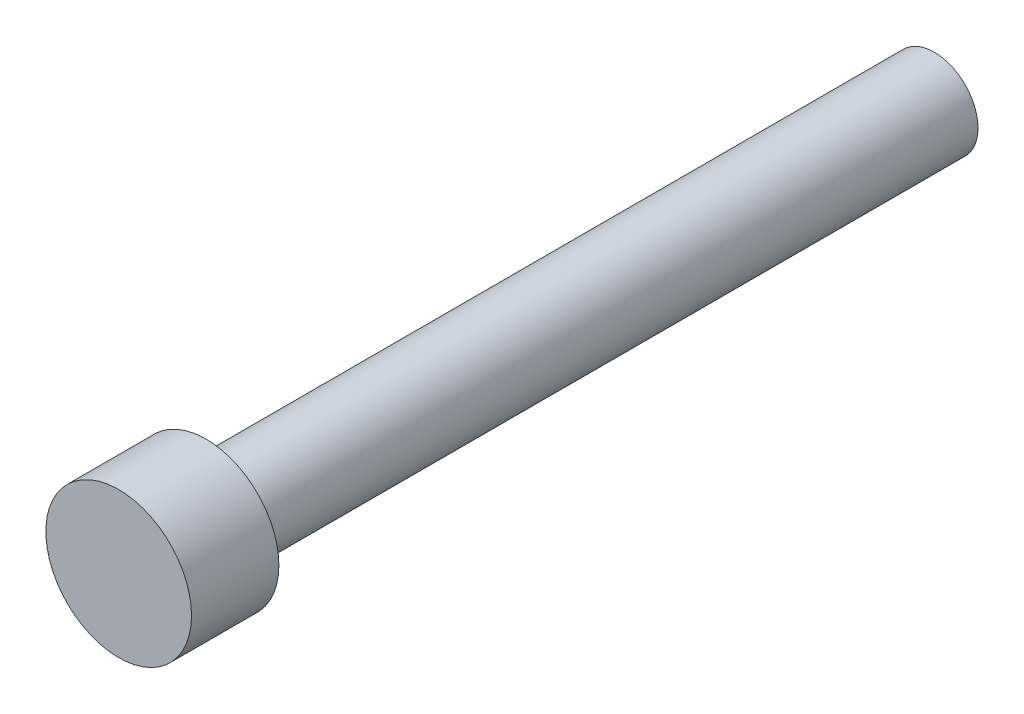
ISO-10303-21;
HEADER;
FILE_DESCRIPTION(('STEP AP214'),'2;1');
FILE_NAME('part.step','',(''),(''),'','','');
FILE_SCHEMA(('AUTOMOTIVE_DESIGN { 1 0 10303 214 1 1 1 1 }'));
ENDSEC;
DATA;
#1=APPLICATION_CONTEXT('core data for automotive mechanical design processes');
#2=APPLICATION_PROTOCOL_DEFINITION('international standard','automotive_design',2000,#1);
#3=PRODUCT_CONTEXT('',#1,'mechanical');
#4=PRODUCT('Part','Part','',(#3));
#5=PRODUCT_RELATED_PRODUCT_CATEGORY('part','',(#4));
#6=PRODUCT_DEFINITION_FORMATION('','',#4);
#7=PRODUCT_DEFINITION_CONTEXT('part definition',#1,'design');
#8=PRODUCT_DEFINITION('design','',#6,#7);
#9=PRODUCT_DEFINITION_SHAPE('','',#8);
#10=(LENGTH_UNIT() NAMED_UNIT(*) SI_UNIT(.MILLI.,.METRE.));
#11=(NAMED_UNIT(*) PLANE_ANGLE_UNIT() SI_UNIT($,.RADIAN.));
#12=(NAMED_UNIT(*) SI_UNIT($,.STERADIAN.) SOLID_ANGLE_UNIT());
#13=UNCERTAINTY_MEASURE_WITH_UNIT(LENGTH_MEASURE(1.E-05),#10,'distance_accuracy_value','');
#14=(GEOMETRIC_REPRESENTATION_CONTEXT(3) GLOBAL_UNCERTAINTY_ASSIGNED_CONTEXT((#13)) GLOBAL_UNIT_ASSIGNED_CONTEXT((#10,
#11,#12)) REPRESENTATION_CONTEXT('',''));
#15=CARTESIAN_POINT('',(0.,0.,0.));
#16=DIRECTION('',(0.,0.,1.));
#17=DIRECTION('',(1.,0.,0.));
#18=AXIS2_PLACEMENT_3D('',#15,#16,#17);
#19=CARTESIAN_POINT('',(0.,0.,3.));
#20=DIRECTION('',(0.,0.,-1.));
#21=DIRECTION('',(-1.,0.,0.));
#22=AXIS2_PLACEMENT_3D('',#19,#20,#21);
#23=CYLINDRICAL_SURFACE('',#22,2.5);
#24=CARTESIAN_POINT('',(0.,0.,3.));
#25=DIRECTION('',(0.,0.,1.));
#26=DIRECTION('',(1.,0.,0.));
#27=AXIS2_PLACEMENT_3D('',#24,#25,#26);
#28=CIRCLE('',#27,2.5);
#29=CARTESIAN_POINT('',(2.5,0.,3.));
#30=VERTEX_POINT('',#29);
#31=EDGE_CURVE('E10',#30,#30,#28,.T.);
#32=ORIENTED_EDGE('',*,*,#31,.F.);
#33=EDGE_LOOP('',(#32));
#34=FACE_BOUND('',#33,.T.);
#35=CARTESIAN_POINT('',(0.,0.,0.));
#36=DIRECTION('',(0.,0.,1.));
#37=DIRECTION('',(1.,0.,0.));
#38=AXIS2_PLACEMENT_3D('',#35,#36,#37);
#39=CIRCLE('',#38,2.5);
#40=CARTESIAN_POINT('',(2.5,0.,0.));
#41=VERTEX_POINT('',#40);
#42=EDGE_CURVE('E42',#41,#41,#39,.T.);
#43=ORIENTED_EDGE('',*,*,#42,.T.);
#44=EDGE_LOOP('',(#43));
#45=FACE_BOUND('',#44,.T.);
#46=ADVANCED_FACE('F39',(#34,#45),#23,.T.);
#47=CARTESIAN_POINT('',(0.,0.,3.));
#48=DIRECTION('',(0.,0.,1.));
#49=DIRECTION('',(1.,0.,0.));
#50=AXIS2_PLACEMENT_3D('',#47,#48,#49);
#51=PLANE('',#50);
#52=ORIENTED_EDGE('',*,*,#31,.T.);
#53=EDGE_LOOP('',(#52));
#54=FACE_BOUND('',#53,.T.);
#55=ADVANCED_FACE('F69',(#54),#51,.T.);
#56=CARTESIAN_POINT('',(0.,0.,0.));
#57=DIRECTION('',(0.,0.,1.));
#58=DIRECTION('',(1.,0.,0.));
#59=AXIS2_PLACEMENT_3D('',#56,#57,#58);
#60=PLANE('',#59);
#61=CARTESIAN_POINT('',(0.,0.,0.));
#62=DIRECTION('',(0.,0.,1.));
#63=DIRECTION('',(1.,0.,0.));
#64=AXIS2_PLACEMENT_3D('',#61,#62,#63);
#65=CIRCLE('',#64,1.5);
#66=CARTESIAN_POINT('',(1.5,0.,0.));
#67=VERTEX_POINT('',#66);
#68=EDGE_CURVE('E51',#67,#67,#65,.T.);
#69=ORIENTED_EDGE('',*,*,#68,.T.);
#70=EDGE_LOOP('',(#69));
#71=FACE_BOUND('',#70,.T.);
#72=ORIENTED_EDGE('',*,*,#42,.F.);
#73=EDGE_LOOP('',(#72));
#74=FACE_BOUND('',#73,.T.);
#75=ADVANCED_FACE('F66',(#71,#74),#60,.F.);
#76=CARTESIAN_POINT('',(0.,0.,-25.));
#77=DIRECTION('',(0.,0.,1.));
#78=DIRECTION('',(1.,0.,0.));
#79=AXIS2_PLACEMENT_3D('',#76,#77,#78);
#80=CYLINDRICAL_SURFACE('',#79,1.5);
#81=CARTESIAN_POINT('',(0.,0.,-25.));
#82=DIRECTION('',(0.,0.,1.));
#83=DIRECTION('',(1.,0.,0.));
#84=AXIS2_PLACEMENT_3D('',#81,#82,#83);
#85=CIRCLE('',#84,1.5);
#86=CARTESIAN_POINT('',(1.5,0.,-25.));
#87=VERTEX_POINT('',#86);
#88=EDGE_CURVE('E49',#87,#87,#85,.T.);
#89=ORIENTED_EDGE('',*,*,#88,.T.);
#90=EDGE_LOOP('',(#89));
#91=FACE_BOUND('',#90,.T.);
#92=ORIENTED_EDGE('',*,*,#68,.F.);
#93=EDGE_LOOP('',(#92));
#94=FACE_BOUND('',#93,.T.);
#95=ADVANCED_FACE('F57',(#91,#94),#80,.T.);
#96=CARTESIAN_POINT('',(0.,0.,-25.));
#97=DIRECTION('',(0.,0.,1.));
#98=DIRECTION('',(1.,0.,0.));
#99=AXIS2_PLACEMENT_3D('',#96,#97,#98);
#100=PLANE('',#99);
#101=ORIENTED_EDGE('',*,*,#88,.F.);
#102=EDGE_LOOP('',(#101));
#103=FACE_BOUND('',#102,.T.);
#104=ADVANCED_FACE('F60',(#103),#100,.F.);
#105=CLOSED_SHELL('',(#46,#55,#75,#95,#104));
#106=MANIFOLD_SOLID_BREP('B2',#105);
#107=ADVANCED_BREP_SHAPE_REPRESENTATION('',(#18,#106),#14);
#108=SHAPE_DEFINITION_REPRESENTATION(#9,#107);
ENDSEC;
END-ISO-10303-21;
